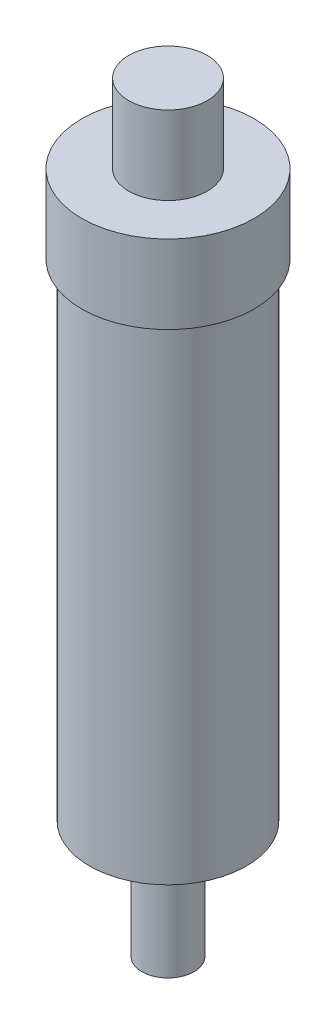
ISO-10303-21;
HEADER;
FILE_DESCRIPTION(('STEP AP214'),'2;1');
FILE_NAME('part.step','',(''),(''),'','','');
FILE_SCHEMA(('AUTOMOTIVE_DESIGN { 1 0 10303 214 1 1 1 1 }'));
ENDSEC;
DATA;
#1=APPLICATION_CONTEXT('core data for automotive mechanical design processes');
#2=APPLICATION_PROTOCOL_DEFINITION('international standard','automotive_design',2000,#1);
#3=PRODUCT_CONTEXT('',#1,'mechanical');
#4=PRODUCT('Part','Part','',(#3));
#5=PRODUCT_RELATED_PRODUCT_CATEGORY('part','',(#4));
#6=PRODUCT_DEFINITION_FORMATION('','',#4);
#7=PRODUCT_DEFINITION_CONTEXT('part definition',#1,'design');
#8=PRODUCT_DEFINITION('design','',#6,#7);
#9=PRODUCT_DEFINITION_SHAPE('','',#8);
#10=(LENGTH_UNIT() NAMED_UNIT(*) SI_UNIT(.MILLI.,.METRE.));
#11=(NAMED_UNIT(*) PLANE_ANGLE_UNIT() SI_UNIT($,.RADIAN.));
#12=(NAMED_UNIT(*) SI_UNIT($,.STERADIAN.) SOLID_ANGLE_UNIT());
#13=UNCERTAINTY_MEASURE_WITH_UNIT(LENGTH_MEASURE(1.E-05),#10,'distance_accuracy_value','');
#14=(GEOMETRIC_REPRESENTATION_CONTEXT(3) GLOBAL_UNCERTAINTY_ASSIGNED_CONTEXT((#13)) GLOBAL_UNIT_ASSIGNED_CONTEXT((#10,
#11,#12)) REPRESENTATION_CONTEXT('',''));
#15=CARTESIAN_POINT('',(0.,0.,0.));
#16=DIRECTION('',(0.,0.,1.));
#17=DIRECTION('',(1.,0.,0.));
#18=AXIS2_PLACEMENT_3D('',#15,#16,#17);
#19=CARTESIAN_POINT('',(0.,-38.1,0.));
#20=DIRECTION('',(0.,-1.,0.));
#21=DIRECTION('',(0.,0.,-1.));
#22=AXIS2_PLACEMENT_3D('',#19,#20,#21);
#23=PLANE('',#22);
#24=CARTESIAN_POINT('',(0.,-38.1,0.));
#25=DIRECTION('',(0.,-1.,0.));
#26=DIRECTION('',(0.,0.,-1.));
#27=AXIS2_PLACEMENT_3D('',#24,#25,#26);
#28=CIRCLE('',#27,1.905);
#29=CARTESIAN_POINT('',(0.,-38.1,-1.905));
#30=VERTEX_POINT('',#29);
#31=EDGE_CURVE('E67',#30,#30,#28,.T.);
#32=ORIENTED_EDGE('',*,*,#31,.F.);
#33=EDGE_LOOP('',(#32));
#34=FACE_BOUND('',#33,.T.);
#35=CARTESIAN_POINT('',(0.,-38.1,0.));
#36=DIRECTION('',(0.,-1.,0.));
#37=DIRECTION('',(0.,0.,-1.));
#38=AXIS2_PLACEMENT_3D('',#35,#36,#37);
#39=CIRCLE('',#38,8.45022262392829);
#40=CARTESIAN_POINT('',(0.,-38.1,-8.45022262392829));
#41=VERTEX_POINT('',#40);
#42=EDGE_CURVE('E10',#41,#41,#39,.T.);
#43=ORIENTED_EDGE('',*,*,#42,.T.);
#44=EDGE_LOOP('',(#43));
#45=FACE_BOUND('',#44,.T.);
#46=ADVANCED_FACE('F33',(#34,#45),#23,.T.);
#47=CARTESIAN_POINT('',(0.,0.,0.));
#48=DIRECTION('',(0.,-1.,0.));
#49=DIRECTION('',(0.,0.,-1.));
#50=AXIS2_PLACEMENT_3D('',#47,#48,#49);
#51=CYLINDRICAL_SURFACE('',#50,8.45022262392829);
#52=CARTESIAN_POINT('',(0.,0.,0.));
#53=DIRECTION('',(0.,-1.,0.));
#54=DIRECTION('',(0.,0.,-1.));
#55=AXIS2_PLACEMENT_3D('',#52,#53,#54);
#56=CIRCLE('',#55,8.45022262392829);
#57=CARTESIAN_POINT('',(0.,0.,-8.45022262392829));
#58=VERTEX_POINT('',#57);
#59=EDGE_CURVE('E39',#58,#58,#56,.T.);
#60=ORIENTED_EDGE('',*,*,#59,.T.);
#61=EDGE_LOOP('',(#60));
#62=FACE_BOUND('',#61,.T.);
#63=ORIENTED_EDGE('',*,*,#42,.F.);
#64=EDGE_LOOP('',(#63));
#65=FACE_BOUND('',#64,.T.);
#66=ADVANCED_FACE('F74',(#62,#65),#51,.T.);
#67=CARTESIAN_POINT('',(8.45022262392829,0.,0.));
#68=DIRECTION('',(0.,-1.,0.));
#69=DIRECTION('',(0.,0.,-1.));
#70=AXIS2_PLACEMENT_3D('',#67,#68,#69);
#71=PLANE('',#70);
#72=CARTESIAN_POINT('',(0.,0.,0.));
#73=DIRECTION('',(0.,-1.,0.));
#74=DIRECTION('',(0.,0.,-1.));
#75=AXIS2_PLACEMENT_3D('',#72,#73,#74);
#76=CIRCLE('',#75,25.4);
#77=CARTESIAN_POINT('',(0.,0.,-25.4));
#78=VERTEX_POINT('',#77);
#79=EDGE_CURVE('E43',#78,#78,#76,.T.);
#80=ORIENTED_EDGE('',*,*,#79,.T.);
#81=EDGE_LOOP('',(#80));
#82=FACE_BOUND('',#81,.T.);
#83=ORIENTED_EDGE('',*,*,#59,.F.);
#84=EDGE_LOOP('',(#83));
#85=FACE_BOUND('',#84,.T.);
#86=ADVANCED_FACE('F78',(#82,#85),#71,.T.);
#87=CARTESIAN_POINT('',(0.,0.,0.));
#88=DIRECTION('',(0.,-1.,0.));
#89=DIRECTION('',(0.,0.,-1.));
#90=AXIS2_PLACEMENT_3D('',#87,#88,#89);
#91=CYLINDRICAL_SURFACE('',#90,25.4);
#92=CARTESIAN_POINT('',(0.,157.48,0.));
#93=DIRECTION('',(0.,-1.,0.));
#94=DIRECTION('',(0.,0.,-1.));
#95=AXIS2_PLACEMENT_3D('',#92,#93,#94);
#96=CIRCLE('',#95,25.4);
#97=CARTESIAN_POINT('',(0.,157.48,-25.4));
#98=VERTEX_POINT('',#97);
#99=EDGE_CURVE('E47',#98,#98,#96,.T.);
#100=ORIENTED_EDGE('',*,*,#99,.T.);
#101=EDGE_LOOP('',(#100));
#102=FACE_BOUND('',#101,.T.);
#103=ORIENTED_EDGE('',*,*,#79,.F.);
#104=EDGE_LOOP('',(#103));
#105=FACE_BOUND('',#104,.T.);
#106=ADVANCED_FACE('F82',(#102,#105),#91,.T.);
#107=CARTESIAN_POINT('',(25.4,157.48,0.));
#108=DIRECTION('',(0.,-1.,0.));
#109=DIRECTION('',(0.,0.,-1.));
#110=AXIS2_PLACEMENT_3D('',#107,#108,#109);
#111=PLANE('',#110);
#112=CARTESIAN_POINT('',(0.,157.48,0.));
#113=DIRECTION('',(0.,-1.,0.));
#114=DIRECTION('',(0.,0.,-1.));
#115=AXIS2_PLACEMENT_3D('',#112,#113,#114);
#116=CIRCLE('',#115,27.94);
#117=CARTESIAN_POINT('',(0.,157.48,-27.94));
#118=VERTEX_POINT('',#117);
#119=EDGE_CURVE('E52',#118,#118,#116,.T.);
#120=ORIENTED_EDGE('',*,*,#119,.T.);
#121=EDGE_LOOP('',(#120));
#122=FACE_BOUND('',#121,.T.);
#123=ORIENTED_EDGE('',*,*,#99,.F.);
#124=EDGE_LOOP('',(#123));
#125=FACE_BOUND('',#124,.T.);
#126=ADVANCED_FACE('F89',(#122,#125),#111,.T.);
#127=CARTESIAN_POINT('',(0.,0.,0.));
#128=DIRECTION('',(0.,-1.,0.));
#129=DIRECTION('',(0.,0.,-1.));
#130=AXIS2_PLACEMENT_3D('',#127,#128,#129);
#131=CYLINDRICAL_SURFACE('',#130,27.94);
#132=CARTESIAN_POINT('',(0.,182.88,0.));
#133=DIRECTION('',(0.,-1.,0.));
#134=DIRECTION('',(0.,0.,-1.));
#135=AXIS2_PLACEMENT_3D('',#132,#133,#134);
#136=CIRCLE('',#135,27.94);
#137=CARTESIAN_POINT('',(0.,182.88,-27.94));
#138=VERTEX_POINT('',#137);
#139=EDGE_CURVE('E55',#138,#138,#136,.T.);
#140=ORIENTED_EDGE('',*,*,#139,.T.);
#141=EDGE_LOOP('',(#140));
#142=FACE_BOUND('',#141,.T.);
#143=ORIENTED_EDGE('',*,*,#119,.F.);
#144=EDGE_LOOP('',(#143));
#145=FACE_BOUND('',#144,.T.);
#146=ADVANCED_FACE('F93',(#142,#145),#131,.T.);
#147=CARTESIAN_POINT('',(12.7,182.88,0.));
#148=DIRECTION('',(0.,1.,0.));
#149=DIRECTION('',(0.,0.,1.));
#150=AXIS2_PLACEMENT_3D('',#147,#148,#149);
#151=PLANE('',#150);
#152=CARTESIAN_POINT('',(0.,182.88,0.));
#153=DIRECTION('',(0.,-1.,0.));
#154=DIRECTION('',(0.,0.,-1.));
#155=AXIS2_PLACEMENT_3D('',#152,#153,#154);
#156=CIRCLE('',#155,12.7);
#157=CARTESIAN_POINT('',(0.,182.88,-12.7));
#158=VERTEX_POINT('',#157);
#159=EDGE_CURVE('E58',#158,#158,#156,.T.);
#160=ORIENTED_EDGE('',*,*,#159,.T.);
#161=EDGE_LOOP('',(#160));
#162=FACE_BOUND('',#161,.T.);
#163=ORIENTED_EDGE('',*,*,#139,.F.);
#164=EDGE_LOOP('',(#163));
#165=FACE_BOUND('',#164,.T.);
#166=ADVANCED_FACE('F97',(#162,#165),#151,.T.);
#167=CARTESIAN_POINT('',(0.,0.,0.));
#168=DIRECTION('',(0.,-1.,0.));
#169=DIRECTION('',(0.,0.,-1.));
#170=AXIS2_PLACEMENT_3D('',#167,#168,#169);
#171=CYLINDRICAL_SURFACE('',#170,12.7);
#172=CARTESIAN_POINT('',(0.,208.28,0.));
#173=DIRECTION('',(0.,-1.,0.));
#174=DIRECTION('',(0.,0.,-1.));
#175=AXIS2_PLACEMENT_3D('',#172,#173,#174);
#176=CIRCLE('',#175,12.7);
#177=CARTESIAN_POINT('',(0.,208.28,-12.7));
#178=VERTEX_POINT('',#177);
#179=EDGE_CURVE('E61',#178,#178,#176,.T.);
#180=ORIENTED_EDGE('',*,*,#179,.T.);
#181=EDGE_LOOP('',(#180));
#182=FACE_BOUND('',#181,.T.);
#183=ORIENTED_EDGE('',*,*,#159,.F.);
#184=EDGE_LOOP('',(#183));
#185=FACE_BOUND('',#184,.T.);
#186=ADVANCED_FACE('F101',(#182,#185),#171,.T.);
#187=CARTESIAN_POINT('',(0.,208.28,0.));
#188=DIRECTION('',(0.,1.,0.));
#189=DIRECTION('',(0.,0.,1.));
#190=AXIS2_PLACEMENT_3D('',#187,#188,#189);
#191=PLANE('',#190);
#192=ORIENTED_EDGE('',*,*,#179,.F.);
#193=EDGE_LOOP('',(#192));
#194=FACE_BOUND('',#193,.T.);
#195=ADVANCED_FACE('F105',(#194),#191,.T.);
#196=CARTESIAN_POINT('',(0.,5.38815367264149,0.));
#197=DIRECTION('',(0.,-1.,0.));
#198=DIRECTION('',(0.,0.,-1.));
#199=AXIS2_PLACEMENT_3D('',#196,#197,#198);
#200=CYLINDRICAL_SURFACE('',#199,1.905);
#201=CARTESIAN_POINT('',(0.,0.,0.));
#202=DIRECTION('',(0.,-1.,0.));
#203=DIRECTION('',(0.,0.,-1.));
#204=AXIS2_PLACEMENT_3D('',#201,#202,#203);
#205=CIRCLE('',#204,1.905);
#206=CARTESIAN_POINT('',(0.,0.,-1.905));
#207=VERTEX_POINT('',#206);
#208=EDGE_CURVE('E64',#207,#207,#205,.F.);
#209=ORIENTED_EDGE('',*,*,#208,.T.);
#210=EDGE_LOOP('',(#209));
#211=FACE_BOUND('',#210,.T.);
#212=ORIENTED_EDGE('',*,*,#31,.T.);
#213=EDGE_LOOP('',(#212));
#214=FACE_BOUND('',#213,.T.);
#215=ADVANCED_FACE('F71',(#211,#214),#200,.F.);
#216=CARTESIAN_POINT('',(8.45022262392829,0.,0.));
#217=DIRECTION('',(0.,-1.,0.));
#218=DIRECTION('',(0.,0.,-1.));
#219=AXIS2_PLACEMENT_3D('',#216,#217,#218);
#220=PLANE('',#219);
#221=ORIENTED_EDGE('',*,*,#208,.F.);
#222=EDGE_LOOP('',(#221));
#223=FACE_BOUND('',#222,.T.);
#224=ADVANCED_FACE('F112',(#223),#220,.T.);
#225=CLOSED_SHELL('',(#46,#66,#86,#106,#126,#146,#166,#186,#195,#215,#224));
#226=MANIFOLD_SOLID_BREP('B2',#225);
#227=ADVANCED_BREP_SHAPE_REPRESENTATION('',(#18,#226),#14);
#228=SHAPE_DEFINITION_REPRESENTATION(#9,#227);
ENDSEC;
END-ISO-10303-21;
